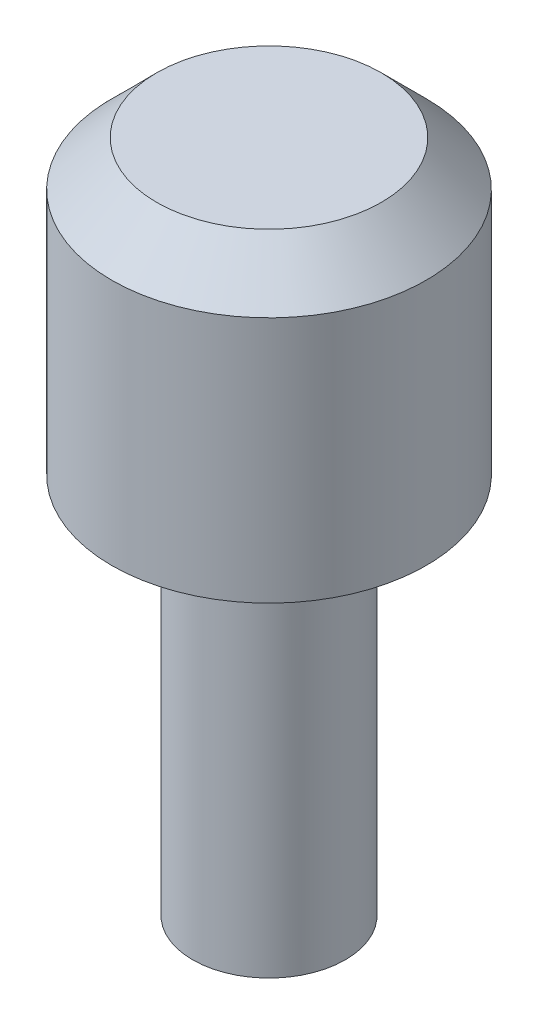
ISO-10303-21;
HEADER;
FILE_DESCRIPTION(('STEP AP214'),'2;1');
FILE_NAME('part.step','',(''),(''),'','','');
FILE_SCHEMA(('AUTOMOTIVE_DESIGN { 1 0 10303 214 1 1 1 1 }'));
ENDSEC;
DATA;
#1=APPLICATION_CONTEXT('core data for automotive mechanical design processes');
#2=APPLICATION_PROTOCOL_DEFINITION('international standard','automotive_design',2000,#1);
#3=PRODUCT_CONTEXT('',#1,'mechanical');
#4=PRODUCT('Part','Part','',(#3));
#5=PRODUCT_RELATED_PRODUCT_CATEGORY('part','',(#4));
#6=PRODUCT_DEFINITION_FORMATION('','',#4);
#7=PRODUCT_DEFINITION_CONTEXT('part definition',#1,'design');
#8=PRODUCT_DEFINITION('design','',#6,#7);
#9=PRODUCT_DEFINITION_SHAPE('','',#8);
#10=(LENGTH_UNIT() NAMED_UNIT(*) SI_UNIT(.MILLI.,.METRE.));
#11=(NAMED_UNIT(*) PLANE_ANGLE_UNIT() SI_UNIT($,.RADIAN.));
#12=(NAMED_UNIT(*) SI_UNIT($,.STERADIAN.) SOLID_ANGLE_UNIT());
#13=UNCERTAINTY_MEASURE_WITH_UNIT(LENGTH_MEASURE(1.E-05),#10,'distance_accuracy_value','');
#14=(GEOMETRIC_REPRESENTATION_CONTEXT(3) GLOBAL_UNCERTAINTY_ASSIGNED_CONTEXT((#13)) GLOBAL_UNIT_ASSIGNED_CONTEXT((#10,
#11,#12)) REPRESENTATION_CONTEXT('',''));
#15=CARTESIAN_POINT('',(0.,0.,0.));
#16=DIRECTION('',(0.,0.,1.));
#17=DIRECTION('',(1.,0.,0.));
#18=AXIS2_PLACEMENT_3D('',#15,#16,#17);
#19=CARTESIAN_POINT('',(0.,0.,0.));
#20=DIRECTION('',(0.,1.,0.));
#21=DIRECTION('',(0.,0.,1.));
#22=AXIS2_PLACEMENT_3D('',#19,#20,#21);
#23=PLANE('',#22);
#24=CARTESIAN_POINT('',(0.,0.,0.));
#25=DIRECTION('',(0.,1.,0.));
#26=DIRECTION('',(0.,0.,1.));
#27=AXIS2_PLACEMENT_3D('',#24,#25,#26);
#28=CIRCLE('',#27,3.5);
#29=CARTESIAN_POINT('',(0.,0.,-3.5));
#30=VERTEX_POINT('',#29);
#31=EDGE_CURVE('E45',#30,#30,#28,.T.);
#32=ORIENTED_EDGE('',*,*,#31,.F.);
#33=EDGE_LOOP('',(#32));
#34=FACE_BOUND('',#33,.T.);
#35=CARTESIAN_POINT('',(0.,0.,0.));
#36=DIRECTION('',(0.,1.,0.));
#37=DIRECTION('',(0.,0.,1.));
#38=AXIS2_PLACEMENT_3D('',#35,#36,#37);
#39=CIRCLE('',#38,1.7);
#40=CARTESIAN_POINT('',(0.,0.,1.7));
#41=VERTEX_POINT('',#40);
#42=EDGE_CURVE('E10',#41,#41,#39,.F.);
#43=ORIENTED_EDGE('',*,*,#42,.F.);
#44=EDGE_LOOP('',(#43));
#45=FACE_BOUND('',#44,.T.);
#46=ADVANCED_FACE('F30',(#34,#45),#23,.F.);
#47=CARTESIAN_POINT('',(0.,6.5,0.));
#48=DIRECTION('',(0.,-1.,0.));
#49=DIRECTION('',(0.,0.,-1.));
#50=AXIS2_PLACEMENT_3D('',#47,#48,#49);
#51=CYLINDRICAL_SURFACE('',#50,3.5);
#52=CARTESIAN_POINT('',(0.,5.5,0.));
#53=DIRECTION('',(0.,1.,0.));
#54=DIRECTION('',(0.,0.,1.));
#55=AXIS2_PLACEMENT_3D('',#52,#53,#54);
#56=CIRCLE('',#55,3.5);
#57=CARTESIAN_POINT('',(0.,5.5,-3.5));
#58=VERTEX_POINT('',#57);
#59=EDGE_CURVE('E37',#58,#58,#56,.F.);
#60=CARTESIAN_POINT('',(0.,5.5,-3.5));
#61=CARTESIAN_POINT('',(0.,5.44270833333334,-3.5));
#62=CARTESIAN_POINT('',(0.,5.38541666666667,-3.5));
#63=CARTESIAN_POINT('',(0.,5.27083333333334,-3.5));
#64=CARTESIAN_POINT('',(0.,5.21354166666667,-3.5));
#65=CARTESIAN_POINT('',(0.,5.09895833333334,-3.5));
#66=CARTESIAN_POINT('',(0.,5.04166666666667,-3.5));
#67=CARTESIAN_POINT('',(0.,4.92708333333334,-3.5));
#68=CARTESIAN_POINT('',(0.,4.86979166666667,-3.5));
#69=CARTESIAN_POINT('',(0.,4.75520833333333,-3.5));
#70=CARTESIAN_POINT('',(0.,4.69791666666667,-3.5));
#71=CARTESIAN_POINT('',(0.,4.58333333333333,-3.5));
#72=CARTESIAN_POINT('',(0.,4.52604166666667,-3.5));
#73=CARTESIAN_POINT('',(0.,4.41145833333334,-3.5));
#74=CARTESIAN_POINT('',(0.,4.35416666666667,-3.5));
#75=CARTESIAN_POINT('',(0.,4.23958333333334,-3.5));
#76=CARTESIAN_POINT('',(0.,4.18229166666667,-3.5));
#77=CARTESIAN_POINT('',(0.,4.06770833333334,-3.5));
#78=CARTESIAN_POINT('',(0.,4.01041666666667,-3.5));
#79=CARTESIAN_POINT('',(0.,3.89583333333333,-3.5));
#80=CARTESIAN_POINT('',(0.,3.83854166666667,-3.5));
#81=CARTESIAN_POINT('',(0.,3.72395833333333,-3.5));
#82=CARTESIAN_POINT('',(0.,3.66666666666667,-3.5));
#83=CARTESIAN_POINT('',(0.,3.55208333333333,-3.5));
#84=CARTESIAN_POINT('',(0.,3.49479166666667,-3.5));
#85=CARTESIAN_POINT('',(0.,3.38020833333333,-3.5));
#86=CARTESIAN_POINT('',(0.,3.32291666666667,-3.5));
#87=CARTESIAN_POINT('',(0.,3.20833333333333,-3.5));
#88=CARTESIAN_POINT('',(0.,3.15104166666667,-3.5));
#89=CARTESIAN_POINT('',(0.,3.03645833333333,-3.5));
#90=CARTESIAN_POINT('',(0.,2.97916666666667,-3.5));
#91=CARTESIAN_POINT('',(0.,2.86458333333333,-3.5));
#92=CARTESIAN_POINT('',(0.,2.80729166666667,-3.5));
#93=CARTESIAN_POINT('',(0.,2.69270833333333,-3.5));
#94=CARTESIAN_POINT('',(0.,2.63541666666667,-3.5));
#95=CARTESIAN_POINT('',(0.,2.52083333333333,-3.5));
#96=CARTESIAN_POINT('',(0.,2.46354166666667,-3.5));
#97=CARTESIAN_POINT('',(0.,2.34895833333333,-3.5));
#98=CARTESIAN_POINT('',(0.,2.29166666666667,-3.5));
#99=CARTESIAN_POINT('',(0.,2.17708333333333,-3.5));
#100=CARTESIAN_POINT('',(0.,2.11979166666667,-3.5));
#101=CARTESIAN_POINT('',(0.,2.00520833333333,-3.5));
#102=CARTESIAN_POINT('',(0.,1.94791666666667,-3.5));
#103=CARTESIAN_POINT('',(0.,1.83333333333333,-3.5));
#104=CARTESIAN_POINT('',(0.,1.77604166666667,-3.5));
#105=CARTESIAN_POINT('',(0.,1.66145833333333,-3.5));
#106=CARTESIAN_POINT('',(0.,1.60416666666667,-3.5));
#107=CARTESIAN_POINT('',(0.,1.48958333333333,-3.5));
#108=CARTESIAN_POINT('',(0.,1.43229166666667,-3.5));
#109=CARTESIAN_POINT('',(0.,1.31770833333333,-3.5));
#110=CARTESIAN_POINT('',(0.,1.26041666666667,-3.5));
#111=CARTESIAN_POINT('',(0.,1.14583333333333,-3.5));
#112=CARTESIAN_POINT('',(0.,1.08854166666667,-3.5));
#113=CARTESIAN_POINT('',(0.,0.973958333333334,-3.5));
#114=CARTESIAN_POINT('',(0.,0.916666666666668,-3.5));
#115=CARTESIAN_POINT('',(0.,0.802083333333334,-3.5));
#116=CARTESIAN_POINT('',(0.,0.744791666666667,-3.5));
#117=CARTESIAN_POINT('',(0.,0.630208333333334,-3.5));
#118=CARTESIAN_POINT('',(0.,0.572916666666667,-3.5));
#119=CARTESIAN_POINT('',(0.,0.458333333333334,-3.5));
#120=CARTESIAN_POINT('',(0.,0.401041666666667,-3.5));
#121=CARTESIAN_POINT('',(0.,0.286458333333334,-3.5));
#122=CARTESIAN_POINT('',(0.,0.229166666666667,-3.5));
#123=CARTESIAN_POINT('',(0.,0.114583333333333,-3.5));
#124=CARTESIAN_POINT('',(0.,0.0572916666666668,-3.5));
#125=CARTESIAN_POINT('',(0.,0.,-3.5));
#126=B_SPLINE_CURVE_WITH_KNOTS('',3,(#60,#61,#62,#63,#64,#65,#66,#67,#68,#69,#70,#71,#72,#73,
#74,#75,#76,#77,#78,#79,#80,#81,#82,#83,#84,#85,#86,#87,#88,#89,#90,#91,#92,#93,#94,#95,#96,#97,
#98,#99,#100,#101,#102,#103,#104,#105,#106,#107,#108,#109,#110,#111,#112,#113,#114,#115,#116,
#117,#118,#119,#120,#121,#122,#123,#124,#125),.UNSPECIFIED.,.F.,.F.,(4,2,2,2,2,2,2,2,2,2,2,2,2,
2,2,2,2,2,2,2,2,2,2,2,2,2,2,2,2,2,2,2,4),(0.,0.171875,0.34375,0.515625,0.687500000000001,
0.859375000000001,1.03125,1.203125,1.375,1.546875,1.71875,1.890625,2.0625,2.234375,2.40625,
2.578125,2.75,2.921875,3.09375,3.265625,3.4375,3.609375,3.78125,3.953125,4.125,4.296875,4.46875,
4.640625,4.8125,4.984375,5.15625,5.328125,5.5),.UNSPECIFIED.);
#127=EDGE_CURVE('BSEAM68',#58,#30,#126,.T.);
#128=ORIENTED_EDGE('',*,*,#59,.T.);
#129=ORIENTED_EDGE('',*,*,#31,.T.);
#130=ORIENTED_EDGE('',*,*,#127,.T.);
#131=ORIENTED_EDGE('',*,*,#127,.F.);
#132=EDGE_LOOP('',(#128,#130,#129,#131));
#133=FACE_BOUND('',#132,.T.);
#134=ADVANCED_FACE('F68',(#133),#51,.T.);
#135=CARTESIAN_POINT('',(0.,6.5,0.));
#136=DIRECTION('',(0.,1.,0.));
#137=DIRECTION('',(0.,0.,1.));
#138=AXIS2_PLACEMENT_3D('',#135,#136,#137);
#139=PLANE('',#138);
#140=CARTESIAN_POINT('',(0.,6.5,0.));
#141=DIRECTION('',(0.,1.,0.));
#142=DIRECTION('',(0.,0.,1.));
#143=AXIS2_PLACEMENT_3D('',#140,#141,#142);
#144=CIRCLE('',#143,2.50000000000001);
#145=CARTESIAN_POINT('',(0.,6.5,2.50000000000001));
#146=VERTEX_POINT('',#145);
#147=EDGE_CURVE('E41',#146,#146,#144,.T.);
#148=ORIENTED_EDGE('',*,*,#147,.T.);
#149=EDGE_LOOP('',(#148));
#150=FACE_BOUND('',#149,.T.);
#151=ADVANCED_FACE('F64',(#150),#139,.T.);
#152=CARTESIAN_POINT('',(0.,6.5,0.));
#153=DIRECTION('',(0.,-1.,0.));
#154=DIRECTION('',(0.,0.,-1.));
#155=AXIS2_PLACEMENT_3D('',#152,#153,#154);
#156=CONICAL_SURFACE('',#155,2.50000000000001,0.785398163397446);
#157=ORIENTED_EDGE('',*,*,#59,.F.);
#158=EDGE_LOOP('',(#157));
#159=FACE_BOUND('',#158,.T.);
#160=ORIENTED_EDGE('',*,*,#147,.F.);
#161=EDGE_LOOP('',(#160));
#162=FACE_BOUND('',#161,.T.);
#163=ADVANCED_FACE('F32',(#159,#162),#156,.T.);
#164=CARTESIAN_POINT('',(0.,-8.5,0.));
#165=DIRECTION('',(0.,1.,0.));
#166=DIRECTION('',(0.,0.,1.));
#167=AXIS2_PLACEMENT_3D('',#164,#165,#166);
#168=CYLINDRICAL_SURFACE('',#167,1.7);
#169=CARTESIAN_POINT('',(0.,-8.5,0.));
#170=DIRECTION('',(0.,-1.,0.));
#171=DIRECTION('',(0.,0.,-1.));
#172=AXIS2_PLACEMENT_3D('',#169,#170,#171);
#173=CIRCLE('',#172,1.7);
#174=CARTESIAN_POINT('',(0.,-8.5,-1.7));
#175=VERTEX_POINT('',#174);
#176=EDGE_CURVE('E50',#175,#175,#173,.T.);
#177=ORIENTED_EDGE('',*,*,#176,.F.);
#178=EDGE_LOOP('',(#177));
#179=FACE_BOUND('',#178,.T.);
#180=ORIENTED_EDGE('',*,*,#42,.T.);
#181=EDGE_LOOP('',(#180));
#182=FACE_BOUND('',#181,.T.);
#183=ADVANCED_FACE('F56',(#179,#182),#168,.T.);
#184=CARTESIAN_POINT('',(0.,-8.5,0.));
#185=DIRECTION('',(0.,-1.,0.));
#186=DIRECTION('',(0.,0.,-1.));
#187=AXIS2_PLACEMENT_3D('',#184,#185,#186);
#188=PLANE('',#187);
#189=ORIENTED_EDGE('',*,*,#176,.T.);
#190=EDGE_LOOP('',(#189));
#191=FACE_BOUND('',#190,.T.);
#192=ADVANCED_FACE('F54',(#191),#188,.T.);
#193=CLOSED_SHELL('',(#46,#134,#151,#163,#183,#192));
#194=MANIFOLD_SOLID_BREP('B2',#193);
#195=ADVANCED_BREP_SHAPE_REPRESENTATION('',(#18,#194),#14);
#196=SHAPE_DEFINITION_REPRESENTATION(#9,#195);
ENDSEC;
END-ISO-10303-21;
